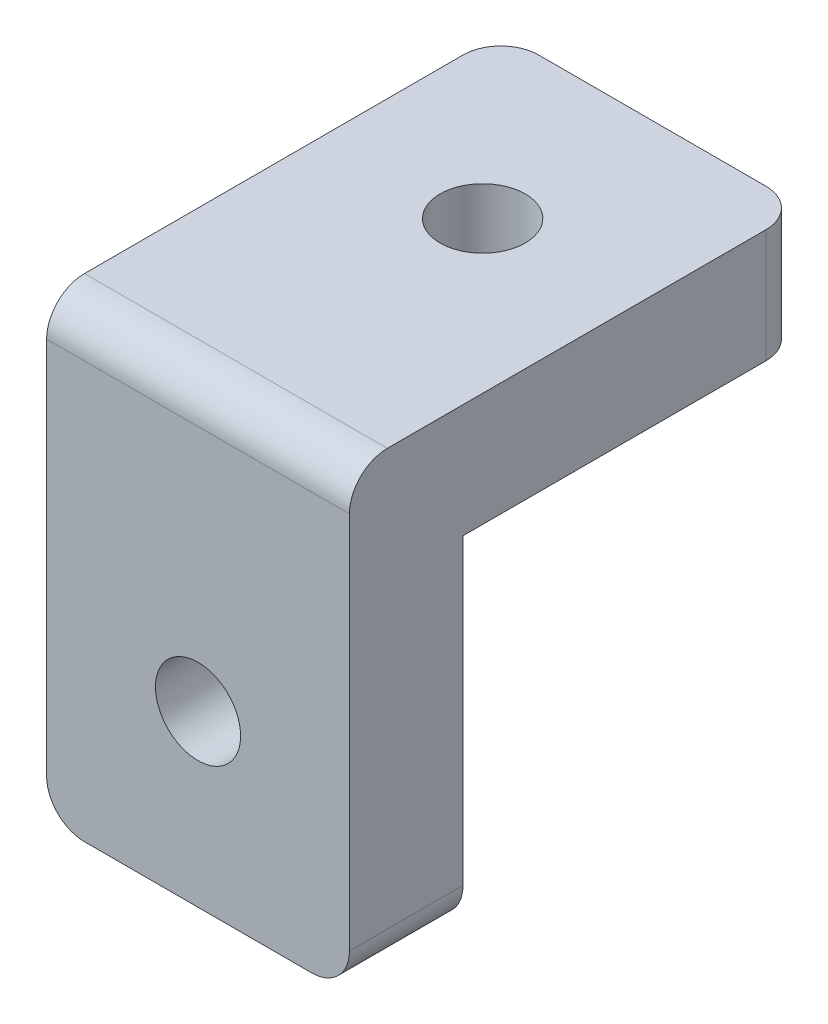
ISO-10303-21;
HEADER;
FILE_DESCRIPTION(('STEP AP214'),'2;1');
FILE_NAME('part.step','',(''),(''),'','','');
FILE_SCHEMA(('AUTOMOTIVE_DESIGN { 1 0 10303 214 1 1 1 1 }'));
ENDSEC;
DATA;
#1=APPLICATION_CONTEXT('core data for automotive mechanical design processes');
#2=APPLICATION_PROTOCOL_DEFINITION('international standard','automotive_design',2000,#1);
#3=PRODUCT_CONTEXT('',#1,'mechanical');
#4=PRODUCT('Part','Part','',(#3));
#5=PRODUCT_RELATED_PRODUCT_CATEGORY('part','',(#4));
#6=PRODUCT_DEFINITION_FORMATION('','',#4);
#7=PRODUCT_DEFINITION_CONTEXT('part definition',#1,'design');
#8=PRODUCT_DEFINITION('design','',#6,#7);
#9=PRODUCT_DEFINITION_SHAPE('','',#8);
#10=(LENGTH_UNIT() NAMED_UNIT(*) SI_UNIT(.MILLI.,.METRE.));
#11=(NAMED_UNIT(*) PLANE_ANGLE_UNIT() SI_UNIT($,.RADIAN.));
#12=(NAMED_UNIT(*) SI_UNIT($,.STERADIAN.) SOLID_ANGLE_UNIT());
#13=UNCERTAINTY_MEASURE_WITH_UNIT(LENGTH_MEASURE(1.E-05),#10,'distance_accuracy_value','');
#14=(GEOMETRIC_REPRESENTATION_CONTEXT(3) GLOBAL_UNCERTAINTY_ASSIGNED_CONTEXT((#13)) GLOBAL_UNIT_ASSIGNED_CONTEXT((#10,
#11,#12)) REPRESENTATION_CONTEXT('',''));
#15=CARTESIAN_POINT('',(0.,0.,0.));
#16=DIRECTION('',(0.,0.,1.));
#17=DIRECTION('',(1.,0.,0.));
#18=AXIS2_PLACEMENT_3D('',#15,#16,#17);
#19=CARTESIAN_POINT('',(8.,0.,-3.));
#20=DIRECTION('',(0.,1.,0.));
#21=DIRECTION('',(0.,0.,1.));
#22=AXIS2_PLACEMENT_3D('',#19,#20,#21);
#23=PLANE('',#22);
#24=DIRECTION('',(-1.,0.,0.));
#25=VECTOR('',#24,1.);
#26=CARTESIAN_POINT('',(8.,0.,-3.));
#27=LINE('',#26,#25);
#28=CARTESIAN_POINT('',(7.,0.,-3.));
#29=VERTEX_POINT('',#28);
#30=CARTESIAN_POINT('',(1.,0.,-3.));
#31=VERTEX_POINT('',#30);
#32=EDGE_CURVE('E137',#29,#31,#27,.T.);
#33=ORIENTED_EDGE('',*,*,#32,.F.);
#34=DIRECTION('',(0.,0.,-1.));
#35=VECTOR('',#34,1.);
#36=CARTESIAN_POINT('',(7.,0.,-3.));
#37=LINE('',#36,#35);
#38=CARTESIAN_POINT('',(7.,0.,0.));
#39=VERTEX_POINT('',#38);
#40=EDGE_CURVE('E178',#29,#39,#37,.F.);
#41=ORIENTED_EDGE('',*,*,#40,.T.);
#42=DIRECTION('',(-1.,0.,0.));
#43=VECTOR('',#42,1.);
#44=CARTESIAN_POINT('',(8.,0.,0.));
#45=LINE('',#44,#43);
#46=CARTESIAN_POINT('',(1.,0.,0.));
#47=VERTEX_POINT('',#46);
#48=EDGE_CURVE('E151',#39,#47,#45,.T.);
#49=ORIENTED_EDGE('',*,*,#48,.T.);
#50=DIRECTION('',(0.,0.,-1.));
#51=VECTOR('',#50,1.);
#52=CARTESIAN_POINT('',(1.,0.,-3.));
#53=LINE('',#52,#51);
#54=EDGE_CURVE('E175',#47,#31,#53,.T.);
#55=ORIENTED_EDGE('',*,*,#54,.T.);
#56=EDGE_LOOP('',(#33,#41,#49,#55));
#57=FACE_BOUND('',#56,.T.);
#58=ADVANCED_FACE('F33',(#57),#23,.F.);
#59=CARTESIAN_POINT('',(8.,9.,-3.));
#60=DIRECTION('',(0.,0.,1.));
#61=DIRECTION('',(0.,-1.,0.));
#62=AXIS2_PLACEMENT_3D('',#59,#60,#61);
#63=PLANE('',#62);
#64=CARTESIAN_POINT('',(4.,4.48099849741745,-3.));
#65=DIRECTION('',(0.,0.,-1.));
#66=DIRECTION('',(0.,1.,0.));
#67=AXIS2_PLACEMENT_3D('',#64,#65,#66);
#68=CIRCLE('',#67,1.125);
#69=CARTESIAN_POINT('',(4.,5.60599849741745,-3.));
#70=VERTEX_POINT('',#69);
#71=EDGE_CURVE('E274',#70,#70,#68,.T.);
#72=ORIENTED_EDGE('',*,*,#71,.F.);
#73=EDGE_LOOP('',(#72));
#74=FACE_BOUND('',#73,.T.);
#75=DIRECTION('',(0.,1.,0.));
#76=VECTOR('',#75,1.);
#77=CARTESIAN_POINT('',(8.,9.,-3.));
#78=LINE('',#77,#76);
#79=CARTESIAN_POINT('',(8.,0.999999999999999,-3.));
#80=VERTEX_POINT('',#79);
#81=CARTESIAN_POINT('',(8.,9.,-3.));
#82=VERTEX_POINT('',#81);
#83=EDGE_CURVE('E117',#80,#82,#78,.T.);
#84=ORIENTED_EDGE('',*,*,#83,.F.);
#85=CARTESIAN_POINT('',(7.,1.,-3.));
#86=DIRECTION('',(0.,0.,1.));
#87=DIRECTION('',(0.,-1.,0.));
#88=AXIS2_PLACEMENT_3D('',#85,#86,#87);
#89=CIRCLE('',#88,1.);
#90=EDGE_CURVE('E173',#80,#29,#89,.F.);
#91=ORIENTED_EDGE('',*,*,#90,.T.);
#92=ORIENTED_EDGE('',*,*,#32,.T.);
#93=CARTESIAN_POINT('',(1.,1.,-3.));
#94=DIRECTION('',(0.,0.,1.));
#95=DIRECTION('',(0.,-1.,0.));
#96=AXIS2_PLACEMENT_3D('',#93,#94,#95);
#97=CIRCLE('',#96,1.);
#98=CARTESIAN_POINT('',(0.,0.999999999999999,-3.));
#99=VERTEX_POINT('',#98);
#100=EDGE_CURVE('E171',#31,#99,#97,.F.);
#101=ORIENTED_EDGE('',*,*,#100,.T.);
#102=DIRECTION('',(0.,1.,0.));
#103=VECTOR('',#102,1.);
#104=CARTESIAN_POINT('',(0.,9.,-3.));
#105=LINE('',#104,#103);
#106=CARTESIAN_POINT('',(0.,9.,-3.));
#107=VERTEX_POINT('',#106);
#108=EDGE_CURVE('E133',#99,#107,#105,.T.);
#109=ORIENTED_EDGE('',*,*,#108,.T.);
#110=DIRECTION('',(-1.,0.,0.));
#111=VECTOR('',#110,1.);
#112=CARTESIAN_POINT('',(8.,9.,-3.));
#113=LINE('',#112,#111);
#114=EDGE_CURVE('E130',#82,#107,#113,.T.);
#115=ORIENTED_EDGE('',*,*,#114,.F.);
#116=EDGE_LOOP('',(#84,#91,#92,#101,#109,#115));
#117=FACE_BOUND('',#116,.T.);
#118=ADVANCED_FACE('F131',(#74,#117),#63,.F.);
#119=CARTESIAN_POINT('',(8.,9.,-12.));
#120=DIRECTION('',(0.,1.,0.));
#121=DIRECTION('',(0.,0.,1.));
#122=AXIS2_PLACEMENT_3D('',#119,#120,#121);
#123=PLANE('',#122);
#124=CARTESIAN_POINT('',(4.,9.,-7.51900150258255));
#125=DIRECTION('',(0.,-1.,0.));
#126=DIRECTION('',(0.,0.,-1.));
#127=AXIS2_PLACEMENT_3D('',#124,#125,#126);
#128=CIRCLE('',#127,1.125);
#129=CARTESIAN_POINT('',(4.,9.,-8.64400150258255));
#130=VERTEX_POINT('',#129);
#131=EDGE_CURVE('E276',#130,#130,#128,.T.);
#132=ORIENTED_EDGE('',*,*,#131,.F.);
#133=EDGE_LOOP('',(#132));
#134=FACE_BOUND('',#133,.T.);
#135=DIRECTION('',(0.,0.,-1.));
#136=VECTOR('',#135,1.);
#137=CARTESIAN_POINT('',(0.,9.,-12.));
#138=LINE('',#137,#136);
#139=CARTESIAN_POINT('',(0.,9.,-11.));
#140=VERTEX_POINT('',#139);
#141=EDGE_CURVE('E153',#107,#140,#138,.T.);
#142=ORIENTED_EDGE('',*,*,#141,.T.);
#143=CARTESIAN_POINT('',(1.,9.,-11.));
#144=DIRECTION('',(0.,1.,0.));
#145=DIRECTION('',(0.,0.,1.));
#146=AXIS2_PLACEMENT_3D('',#143,#144,#145);
#147=CIRCLE('',#146,1.);
#148=CARTESIAN_POINT('',(1.,9.,-12.));
#149=VERTEX_POINT('',#148);
#150=EDGE_CURVE('E200',#140,#149,#147,.F.);
#151=ORIENTED_EDGE('',*,*,#150,.T.);
#152=DIRECTION('',(-1.,0.,0.));
#153=VECTOR('',#152,1.);
#154=CARTESIAN_POINT('',(8.,9.,-12.));
#155=LINE('',#154,#153);
#156=CARTESIAN_POINT('',(7.,9.,-12.));
#157=VERTEX_POINT('',#156);
#158=EDGE_CURVE('E138',#157,#149,#155,.T.);
#159=ORIENTED_EDGE('',*,*,#158,.F.);
#160=CARTESIAN_POINT('',(7.,9.,-11.));
#161=DIRECTION('',(0.,1.,0.));
#162=DIRECTION('',(0.,0.,1.));
#163=AXIS2_PLACEMENT_3D('',#160,#161,#162);
#164=CIRCLE('',#163,1.);
#165=CARTESIAN_POINT('',(8.,9.,-11.));
#166=VERTEX_POINT('',#165);
#167=EDGE_CURVE('E143',#157,#166,#164,.F.);
#168=ORIENTED_EDGE('',*,*,#167,.T.);
#169=DIRECTION('',(0.,0.,-1.));
#170=VECTOR('',#169,1.);
#171=CARTESIAN_POINT('',(8.,9.,-12.));
#172=LINE('',#171,#170);
#173=EDGE_CURVE('E122',#82,#166,#172,.T.);
#174=ORIENTED_EDGE('',*,*,#173,.F.);
#175=ORIENTED_EDGE('',*,*,#114,.T.);
#176=EDGE_LOOP('',(#142,#151,#159,#168,#174,#175));
#177=FACE_BOUND('',#176,.T.);
#178=ADVANCED_FACE('F140',(#134,#177),#123,.F.);
#179=CARTESIAN_POINT('',(8.,12.,-12.));
#180=DIRECTION('',(0.,0.,1.));
#181=DIRECTION('',(0.,-1.,0.));
#182=AXIS2_PLACEMENT_3D('',#179,#180,#181);
#183=PLANE('',#182);
#184=ORIENTED_EDGE('',*,*,#158,.T.);
#185=DIRECTION('',(0.,1.,0.));
#186=VECTOR('',#185,1.);
#187=CARTESIAN_POINT('',(1.,12.,-12.));
#188=LINE('',#187,#186);
#189=CARTESIAN_POINT('',(1.,12.,-12.));
#190=VERTEX_POINT('',#189);
#191=EDGE_CURVE('E192',#149,#190,#188,.T.);
#192=ORIENTED_EDGE('',*,*,#191,.T.);
#193=DIRECTION('',(-1.,0.,0.));
#194=VECTOR('',#193,1.);
#195=CARTESIAN_POINT('',(8.,12.,-12.));
#196=LINE('',#195,#194);
#197=CARTESIAN_POINT('',(7.,12.,-12.));
#198=VERTEX_POINT('',#197);
#199=EDGE_CURVE('E161',#198,#190,#196,.T.);
#200=ORIENTED_EDGE('',*,*,#199,.F.);
#201=DIRECTION('',(0.,1.,0.));
#202=VECTOR('',#201,1.);
#203=CARTESIAN_POINT('',(7.,12.,-12.));
#204=LINE('',#203,#202);
#205=EDGE_CURVE('E190',#198,#157,#204,.F.);
#206=ORIENTED_EDGE('',*,*,#205,.T.);
#207=EDGE_LOOP('',(#184,#192,#200,#206));
#208=FACE_BOUND('',#207,.T.);
#209=ADVANCED_FACE('F243',(#208),#183,.F.);
#210=CARTESIAN_POINT('',(8.,12.,0.));
#211=DIRECTION('',(0.,-1.,0.));
#212=DIRECTION('',(0.,0.,-1.));
#213=AXIS2_PLACEMENT_3D('',#210,#211,#212);
#214=PLANE('',#213);
#215=CARTESIAN_POINT('',(4.,12.,-7.51900150258255));
#216=DIRECTION('',(0.,-1.,0.));
#217=DIRECTION('',(0.,0.,-1.));
#218=AXIS2_PLACEMENT_3D('',#215,#216,#217);
#219=CIRCLE('',#218,1.125);
#220=CARTESIAN_POINT('',(4.,12.,-8.64400150258255));
#221=VERTEX_POINT('',#220);
#222=EDGE_CURVE('E154',#221,#221,#219,.T.);
#223=ORIENTED_EDGE('',*,*,#222,.T.);
#224=EDGE_LOOP('',(#223));
#225=FACE_BOUND('',#224,.T.);
#226=DIRECTION('',(0.,0.,1.));
#227=VECTOR('',#226,1.);
#228=CARTESIAN_POINT('',(0.,12.,0.));
#229=LINE('',#228,#227);
#230=CARTESIAN_POINT('',(0.,12.,-11.));
#231=VERTEX_POINT('',#230);
#232=CARTESIAN_POINT('',(0.,12.,-1.));
#233=VERTEX_POINT('',#232);
#234=EDGE_CURVE('E156',#231,#233,#229,.T.);
#235=ORIENTED_EDGE('',*,*,#234,.T.);
#236=DIRECTION('',(-1.,0.,0.));
#237=VECTOR('',#236,1.);
#238=CARTESIAN_POINT('',(8.,12.,-1.));
#239=LINE('',#238,#237);
#240=CARTESIAN_POINT('',(8.,12.,-1.));
#241=VERTEX_POINT('',#240);
#242=EDGE_CURVE('E41',#233,#241,#239,.F.);
#243=ORIENTED_EDGE('',*,*,#242,.T.);
#244=DIRECTION('',(0.,0.,1.));
#245=VECTOR('',#244,1.);
#246=CARTESIAN_POINT('',(8.,12.,0.));
#247=LINE('',#246,#245);
#248=CARTESIAN_POINT('',(8.,12.,-11.));
#249=VERTEX_POINT('',#248);
#250=EDGE_CURVE('E144',#249,#241,#247,.T.);
#251=ORIENTED_EDGE('',*,*,#250,.F.);
#252=CARTESIAN_POINT('',(7.,12.,-11.));
#253=DIRECTION('',(0.,-1.,0.));
#254=DIRECTION('',(0.,0.,-1.));
#255=AXIS2_PLACEMENT_3D('',#252,#253,#254);
#256=CIRCLE('',#255,1.);
#257=EDGE_CURVE('E195',#249,#198,#256,.F.);
#258=ORIENTED_EDGE('',*,*,#257,.T.);
#259=ORIENTED_EDGE('',*,*,#199,.T.);
#260=CARTESIAN_POINT('',(1.,12.,-11.));
#261=DIRECTION('',(0.,-1.,0.));
#262=DIRECTION('',(0.,0.,-1.));
#263=AXIS2_PLACEMENT_3D('',#260,#261,#262);
#264=CIRCLE('',#263,1.);
#265=EDGE_CURVE('E197',#190,#231,#264,.F.);
#266=ORIENTED_EDGE('',*,*,#265,.T.);
#267=EDGE_LOOP('',(#235,#243,#251,#258,#259,#266));
#268=FACE_BOUND('',#267,.T.);
#269=ADVANCED_FACE('F247',(#225,#268),#214,.F.);
#270=CARTESIAN_POINT('',(8.,0.,0.));
#271=DIRECTION('',(0.,0.,-1.));
#272=DIRECTION('',(-1.,0.,0.));
#273=AXIS2_PLACEMENT_3D('',#270,#271,#272);
#274=PLANE('',#273);
#275=CARTESIAN_POINT('',(4.,4.48099849741745,0.));
#276=DIRECTION('',(0.,0.,-1.));
#277=DIRECTION('',(0.,1.,0.));
#278=AXIS2_PLACEMENT_3D('',#275,#276,#277);
#279=CIRCLE('',#278,1.125);
#280=CARTESIAN_POINT('',(4.,5.60599849741745,0.));
#281=VERTEX_POINT('',#280);
#282=EDGE_CURVE('E271',#281,#281,#279,.T.);
#283=ORIENTED_EDGE('',*,*,#282,.T.);
#284=EDGE_LOOP('',(#283));
#285=FACE_BOUND('',#284,.T.);
#286=DIRECTION('',(0.,-1.,0.));
#287=VECTOR('',#286,1.);
#288=CARTESIAN_POINT('',(8.,0.,0.));
#289=LINE('',#288,#287);
#290=CARTESIAN_POINT('',(8.,11.,0.));
#291=VERTEX_POINT('',#290);
#292=CARTESIAN_POINT('',(8.,1.,0.));
#293=VERTEX_POINT('',#292);
#294=EDGE_CURVE('E146',#291,#293,#289,.T.);
#295=ORIENTED_EDGE('',*,*,#294,.F.);
#296=DIRECTION('',(-1.,0.,0.));
#297=VECTOR('',#296,1.);
#298=CARTESIAN_POINT('',(8.,11.,0.));
#299=LINE('',#298,#297);
#300=CARTESIAN_POINT('',(0.,11.,0.));
#301=VERTEX_POINT('',#300);
#302=EDGE_CURVE('E202',#291,#301,#299,.T.);
#303=ORIENTED_EDGE('',*,*,#302,.T.);
#304=DIRECTION('',(0.,-1.,0.));
#305=VECTOR('',#304,1.);
#306=CARTESIAN_POINT('',(0.,0.,0.));
#307=LINE('',#306,#305);
#308=CARTESIAN_POINT('',(0.,1.,0.));
#309=VERTEX_POINT('',#308);
#310=EDGE_CURVE('E127',#301,#309,#307,.T.);
#311=ORIENTED_EDGE('',*,*,#310,.T.);
#312=CARTESIAN_POINT('',(1.,1.,0.));
#313=DIRECTION('',(0.,0.,-1.));
#314=DIRECTION('',(-1.,0.,0.));
#315=AXIS2_PLACEMENT_3D('',#312,#313,#314);
#316=CIRCLE('',#315,1.);
#317=EDGE_CURVE('E180',#309,#47,#316,.F.);
#318=ORIENTED_EDGE('',*,*,#317,.T.);
#319=ORIENTED_EDGE('',*,*,#48,.F.);
#320=CARTESIAN_POINT('',(7.,1.,0.));
#321=DIRECTION('',(0.,0.,-1.));
#322=DIRECTION('',(-1.,0.,0.));
#323=AXIS2_PLACEMENT_3D('',#320,#321,#322);
#324=CIRCLE('',#323,1.);
#325=EDGE_CURVE('E182',#39,#293,#324,.F.);
#326=ORIENTED_EDGE('',*,*,#325,.T.);
#327=EDGE_LOOP('',(#295,#303,#311,#318,#319,#326));
#328=FACE_BOUND('',#327,.T.);
#329=ADVANCED_FACE('F208',(#285,#328),#274,.F.);
#330=CARTESIAN_POINT('',(8.,0.,0.));
#331=DIRECTION('',(-1.,0.,0.));
#332=DIRECTION('',(0.,0.,1.));
#333=AXIS2_PLACEMENT_3D('',#330,#331,#332);
#334=PLANE('',#333);
#335=ORIENTED_EDGE('',*,*,#250,.T.);
#336=CARTESIAN_POINT('',(8.,11.,-1.));
#337=DIRECTION('',(-1.,0.,0.));
#338=DIRECTION('',(0.,0.,1.));
#339=AXIS2_PLACEMENT_3D('',#336,#337,#338);
#340=CIRCLE('',#339,1.);
#341=EDGE_CURVE('E11',#241,#291,#340,.F.);
#342=ORIENTED_EDGE('',*,*,#341,.T.);
#343=ORIENTED_EDGE('',*,*,#294,.T.);
#344=DIRECTION('',(0.,0.,-1.));
#345=VECTOR('',#344,1.);
#346=CARTESIAN_POINT('',(8.,1.,0.));
#347=LINE('',#346,#345);
#348=EDGE_CURVE('E125',#293,#80,#347,.T.);
#349=ORIENTED_EDGE('',*,*,#348,.T.);
#350=ORIENTED_EDGE('',*,*,#83,.T.);
#351=ORIENTED_EDGE('',*,*,#173,.T.);
#352=DIRECTION('',(0.,1.,0.));
#353=VECTOR('',#352,1.);
#354=CARTESIAN_POINT('',(8.,0.,-11.));
#355=LINE('',#354,#353);
#356=EDGE_CURVE('E168',#166,#249,#355,.T.);
#357=ORIENTED_EDGE('',*,*,#356,.T.);
#358=EDGE_LOOP('',(#335,#342,#343,#349,#350,#351,#357));
#359=FACE_BOUND('',#358,.T.);
#360=ADVANCED_FACE('F119',(#359),#334,.F.);
#361=CARTESIAN_POINT('',(0.,0.,0.));
#362=DIRECTION('',(-1.,0.,0.));
#363=DIRECTION('',(0.,0.,1.));
#364=AXIS2_PLACEMENT_3D('',#361,#362,#363);
#365=PLANE('',#364);
#366=ORIENTED_EDGE('',*,*,#310,.F.);
#367=CARTESIAN_POINT('',(0.,11.,-1.));
#368=DIRECTION('',(-1.,0.,0.));
#369=DIRECTION('',(0.,0.,1.));
#370=AXIS2_PLACEMENT_3D('',#367,#368,#369);
#371=CIRCLE('',#370,1.);
#372=EDGE_CURVE('E55',#301,#233,#371,.T.);
#373=ORIENTED_EDGE('',*,*,#372,.T.);
#374=ORIENTED_EDGE('',*,*,#234,.F.);
#375=DIRECTION('',(0.,1.,0.));
#376=VECTOR('',#375,1.);
#377=CARTESIAN_POINT('',(0.,9.,-11.));
#378=LINE('',#377,#376);
#379=EDGE_CURVE('E185',#231,#140,#378,.F.);
#380=ORIENTED_EDGE('',*,*,#379,.T.);
#381=ORIENTED_EDGE('',*,*,#141,.F.);
#382=ORIENTED_EDGE('',*,*,#108,.F.);
#383=DIRECTION('',(0.,0.,-1.));
#384=VECTOR('',#383,1.);
#385=CARTESIAN_POINT('',(0.,1.,0.));
#386=LINE('',#385,#384);
#387=EDGE_CURVE('E187',#99,#309,#386,.F.);
#388=ORIENTED_EDGE('',*,*,#387,.T.);
#389=EDGE_LOOP('',(#366,#373,#374,#380,#381,#382,#388));
#390=FACE_BOUND('',#389,.T.);
#391=ADVANCED_FACE('F211',(#390),#365,.T.);
#392=CARTESIAN_POINT('',(7.,1.,0.));
#393=DIRECTION('',(0.,0.,-1.));
#394=DIRECTION('',(-1.,0.,0.));
#395=AXIS2_PLACEMENT_3D('',#392,#393,#394);
#396=CYLINDRICAL_SURFACE('',#395,1.);
#397=ORIENTED_EDGE('',*,*,#325,.F.);
#398=ORIENTED_EDGE('',*,*,#40,.F.);
#399=ORIENTED_EDGE('',*,*,#90,.F.);
#400=ORIENTED_EDGE('',*,*,#348,.F.);
#401=EDGE_LOOP('',(#397,#398,#399,#400));
#402=FACE_BOUND('',#401,.T.);
#403=ADVANCED_FACE('F223',(#402),#396,.T.);
#404=CARTESIAN_POINT('',(1.,1.,-3.));
#405=DIRECTION('',(0.,0.,1.));
#406=DIRECTION('',(1.,0.,0.));
#407=AXIS2_PLACEMENT_3D('',#404,#405,#406);
#408=CYLINDRICAL_SURFACE('',#407,1.);
#409=ORIENTED_EDGE('',*,*,#317,.F.);
#410=ORIENTED_EDGE('',*,*,#387,.F.);
#411=ORIENTED_EDGE('',*,*,#100,.F.);
#412=ORIENTED_EDGE('',*,*,#54,.F.);
#413=EDGE_LOOP('',(#409,#410,#411,#412));
#414=FACE_BOUND('',#413,.T.);
#415=ADVANCED_FACE('F216',(#414),#408,.T.);
#416=CARTESIAN_POINT('',(1.,12.,-11.));
#417=DIRECTION('',(0.,-1.,0.));
#418=DIRECTION('',(0.,0.,-1.));
#419=AXIS2_PLACEMENT_3D('',#416,#417,#418);
#420=CYLINDRICAL_SURFACE('',#419,1.);
#421=ORIENTED_EDGE('',*,*,#150,.F.);
#422=ORIENTED_EDGE('',*,*,#379,.F.);
#423=ORIENTED_EDGE('',*,*,#265,.F.);
#424=ORIENTED_EDGE('',*,*,#191,.F.);
#425=EDGE_LOOP('',(#421,#422,#423,#424));
#426=FACE_BOUND('',#425,.T.);
#427=ADVANCED_FACE('F230',(#426),#420,.T.);
#428=CARTESIAN_POINT('',(7.,0.,-11.));
#429=DIRECTION('',(0.,1.,0.));
#430=DIRECTION('',(0.,0.,1.));
#431=AXIS2_PLACEMENT_3D('',#428,#429,#430);
#432=CYLINDRICAL_SURFACE('',#431,1.);
#433=ORIENTED_EDGE('',*,*,#167,.F.);
#434=ORIENTED_EDGE('',*,*,#205,.F.);
#435=ORIENTED_EDGE('',*,*,#257,.F.);
#436=ORIENTED_EDGE('',*,*,#356,.F.);
#437=EDGE_LOOP('',(#433,#434,#435,#436));
#438=FACE_BOUND('',#437,.T.);
#439=ADVANCED_FACE('F261',(#438),#432,.T.);
#440=CARTESIAN_POINT('',(4.,12.,-7.51900150258255));
#441=DIRECTION('',(0.,-1.,0.));
#442=DIRECTION('',(0.,0.,-1.));
#443=AXIS2_PLACEMENT_3D('',#440,#441,#442);
#444=CYLINDRICAL_SURFACE('',#443,1.125);
#445=CARTESIAN_POINT('',(4.,12.,-8.64400150258255));
#446=CARTESIAN_POINT('',(4.,11.96875,-8.64400150258255));
#447=CARTESIAN_POINT('',(4.,11.9375,-8.64400150258255));
#448=CARTESIAN_POINT('',(4.,11.875,-8.64400150258255));
#449=CARTESIAN_POINT('',(4.,11.84375,-8.64400150258255));
#450=CARTESIAN_POINT('',(4.,11.78125,-8.64400150258255));
#451=CARTESIAN_POINT('',(4.,11.75,-8.64400150258255));
#452=CARTESIAN_POINT('',(4.,11.6875,-8.64400150258255));
#453=CARTESIAN_POINT('',(4.,11.65625,-8.64400150258255));
#454=CARTESIAN_POINT('',(4.,11.59375,-8.64400150258255));
#455=CARTESIAN_POINT('',(4.,11.5625,-8.64400150258255));
#456=CARTESIAN_POINT('',(4.,11.5,-8.64400150258255));
#457=CARTESIAN_POINT('',(4.,11.46875,-8.64400150258255));
#458=CARTESIAN_POINT('',(4.,11.40625,-8.64400150258255));
#459=CARTESIAN_POINT('',(4.,11.375,-8.64400150258255));
#460=CARTESIAN_POINT('',(4.,11.3125,-8.64400150258255));
#461=CARTESIAN_POINT('',(4.,11.28125,-8.64400150258255));
#462=CARTESIAN_POINT('',(4.,11.21875,-8.64400150258255));
#463=CARTESIAN_POINT('',(4.,11.1875,-8.64400150258255));
#464=CARTESIAN_POINT('',(4.,11.125,-8.64400150258255));
#465=CARTESIAN_POINT('',(4.,11.09375,-8.64400150258255));
#466=CARTESIAN_POINT('',(4.,11.03125,-8.64400150258255));
#467=CARTESIAN_POINT('',(4.,11.,-8.64400150258255));
#468=CARTESIAN_POINT('',(4.,10.9375,-8.64400150258255));
#469=CARTESIAN_POINT('',(4.,10.90625,-8.64400150258255));
#470=CARTESIAN_POINT('',(4.,10.84375,-8.64400150258255));
#471=CARTESIAN_POINT('',(4.,10.8125,-8.64400150258255));
#472=CARTESIAN_POINT('',(4.,10.75,-8.64400150258255));
#473=CARTESIAN_POINT('',(4.,10.71875,-8.64400150258255));
#474=CARTESIAN_POINT('',(4.,10.65625,-8.64400150258255));
#475=CARTESIAN_POINT('',(4.,10.625,-8.64400150258255));
#476=CARTESIAN_POINT('',(4.,10.5625,-8.64400150258255));
#477=CARTESIAN_POINT('',(4.,10.53125,-8.64400150258255));
#478=CARTESIAN_POINT('',(4.,10.46875,-8.64400150258255));
#479=CARTESIAN_POINT('',(4.,10.4375,-8.64400150258255));
#480=CARTESIAN_POINT('',(4.,10.375,-8.64400150258255));
#481=CARTESIAN_POINT('',(4.,10.34375,-8.64400150258255));
#482=CARTESIAN_POINT('',(4.,10.28125,-8.64400150258255));
#483=CARTESIAN_POINT('',(4.,10.25,-8.64400150258255));
#484=CARTESIAN_POINT('',(4.,10.1875,-8.64400150258255));
#485=CARTESIAN_POINT('',(4.,10.15625,-8.64400150258255));
#486=CARTESIAN_POINT('',(4.,10.09375,-8.64400150258255));
#487=CARTESIAN_POINT('',(4.,10.0625,-8.64400150258255));
#488=CARTESIAN_POINT('',(4.,10.,-8.64400150258255));
#489=CARTESIAN_POINT('',(4.,9.96875,-8.64400150258255));
#490=CARTESIAN_POINT('',(4.,9.90625,-8.64400150258255));
#491=CARTESIAN_POINT('',(4.,9.875,-8.64400150258255));
#492=CARTESIAN_POINT('',(4.,9.8125,-8.64400150258255));
#493=CARTESIAN_POINT('',(4.,9.78125,-8.64400150258255));
#494=CARTESIAN_POINT('',(4.,9.71875,-8.64400150258255));
#495=CARTESIAN_POINT('',(4.,9.6875,-8.64400150258255));
#496=CARTESIAN_POINT('',(4.,9.625,-8.64400150258255));
#497=CARTESIAN_POINT('',(4.,9.59375,-8.64400150258255));
#498=CARTESIAN_POINT('',(4.,9.53125,-8.64400150258255));
#499=CARTESIAN_POINT('',(4.,9.5,-8.64400150258255));
#500=CARTESIAN_POINT('',(4.,9.4375,-8.64400150258255));
#501=CARTESIAN_POINT('',(4.,9.40625,-8.64400150258255));
#502=CARTESIAN_POINT('',(4.,9.34375,-8.64400150258255));
#503=CARTESIAN_POINT('',(4.,9.3125,-8.64400150258255));
#504=CARTESIAN_POINT('',(4.,9.25,-8.64400150258255));
#505=CARTESIAN_POINT('',(4.,9.21875,-8.64400150258255));
#506=CARTESIAN_POINT('',(4.,9.15625,-8.64400150258255));
#507=CARTESIAN_POINT('',(4.,9.125,-8.64400150258255));
#508=CARTESIAN_POINT('',(4.,9.0625,-8.64400150258255));
#509=CARTESIAN_POINT('',(4.,9.03125,-8.64400150258255));
#510=CARTESIAN_POINT('',(4.,9.,-8.64400150258255));
#511=B_SPLINE_CURVE_WITH_KNOTS('',3,(#445,#446,#447,#448,#449,#450,#451,#452,#453,#454,#455,
#456,#457,#458,#459,#460,#461,#462,#463,#464,#465,#466,#467,#468,#469,#470,#471,#472,#473,#474,
#475,#476,#477,#478,#479,#480,#481,#482,#483,#484,#485,#486,#487,#488,#489,#490,#491,#492,#493,
#494,#495,#496,#497,#498,#499,#500,#501,#502,#503,#504,#505,#506,#507,#508,#509,#510),
.UNSPECIFIED.,.F.,.F.,(4,2,2,2,2,2,2,2,2,2,2,2,2,2,2,2,2,2,2,2,2,2,2,2,2,2,2,2,2,2,2,2,4),(0.,
0.0937499999999983,0.187499999999998,0.281249999999999,0.374999999999999,0.468749999999999,
0.562499999999999,0.656249999999999,0.749999999999999,0.843749999999999,0.937499999999999,
1.03125,1.125,1.21875,1.3125,1.40625,1.5,1.59375,1.6875,1.78125,1.875,1.96875,2.0625,2.15625,
2.25,2.34375,2.4375,2.53125,2.625,2.71875,2.8125,2.90625,3.),.UNSPECIFIED.);
#512=EDGE_CURVE('BSEAM257',#221,#130,#511,.T.);
#513=ORIENTED_EDGE('',*,*,#222,.F.);
#514=ORIENTED_EDGE('',*,*,#131,.T.);
#515=ORIENTED_EDGE('',*,*,#512,.T.);
#516=ORIENTED_EDGE('',*,*,#512,.F.);
#517=EDGE_LOOP('',(#513,#515,#514,#516));
#518=FACE_BOUND('',#517,.T.);
#519=ADVANCED_FACE('F257',(#518),#444,.F.);
#520=CARTESIAN_POINT('',(4.,4.48099849741745,0.));
#521=DIRECTION('',(0.,0.,-1.));
#522=DIRECTION('',(0.,1.,0.));
#523=AXIS2_PLACEMENT_3D('',#520,#521,#522);
#524=CYLINDRICAL_SURFACE('',#523,1.125);
#525=ORIENTED_EDGE('',*,*,#282,.F.);
#526=EDGE_LOOP('',(#525));
#527=FACE_BOUND('',#526,.T.);
#528=ORIENTED_EDGE('',*,*,#71,.T.);
#529=EDGE_LOOP('',(#528));
#530=FACE_BOUND('',#529,.T.);
#531=ADVANCED_FACE('F260',(#527,#530),#524,.F.);
#532=CARTESIAN_POINT('',(8.,11.,-1.));
#533=DIRECTION('',(-1.,0.,0.));
#534=DIRECTION('',(0.,0.,1.));
#535=AXIS2_PLACEMENT_3D('',#532,#533,#534);
#536=CYLINDRICAL_SURFACE('',#535,1.);
#537=ORIENTED_EDGE('',*,*,#341,.F.);
#538=ORIENTED_EDGE('',*,*,#242,.F.);
#539=ORIENTED_EDGE('',*,*,#372,.F.);
#540=ORIENTED_EDGE('',*,*,#302,.F.);
#541=EDGE_LOOP('',(#537,#538,#539,#540));
#542=FACE_BOUND('',#541,.T.);
#543=ADVANCED_FACE('F35',(#542),#536,.T.);
#544=CLOSED_SHELL('',(#58,#118,#178,#209,#269,#329,#360,#391,#403,#415,#427,#439,#519,#531,#543));
#545=MANIFOLD_SOLID_BREP('B2',#544);
#546=ADVANCED_BREP_SHAPE_REPRESENTATION('',(#18,#545),#14);
#547=SHAPE_DEFINITION_REPRESENTATION(#9,#546);
ENDSEC;
END-ISO-10303-21;
